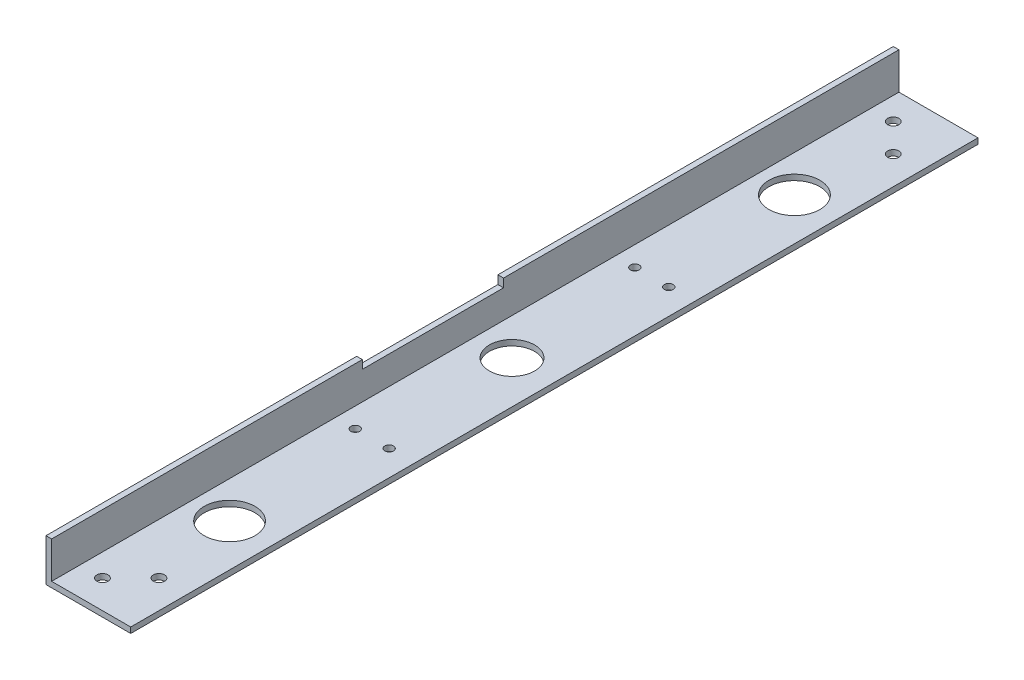
ISO-10303-21;
HEADER;
FILE_DESCRIPTION(('STEP AP214'),'2;1');
FILE_NAME('part.step','',(''),(''),'','','');
FILE_SCHEMA(('AUTOMOTIVE_DESIGN { 1 0 10303 214 1 1 1 1 }'));
ENDSEC;
DATA;
#1=APPLICATION_CONTEXT('core data for automotive mechanical design processes');
#2=APPLICATION_PROTOCOL_DEFINITION('international standard','automotive_design',2000,#1);
#3=PRODUCT_CONTEXT('',#1,'mechanical');
#4=PRODUCT('Part','Part','',(#3));
#5=PRODUCT_RELATED_PRODUCT_CATEGORY('part','',(#4));
#6=PRODUCT_DEFINITION_FORMATION('','',#4);
#7=PRODUCT_DEFINITION_CONTEXT('part definition',#1,'design');
#8=PRODUCT_DEFINITION('design','',#6,#7);
#9=PRODUCT_DEFINITION_SHAPE('','',#8);
#10=(LENGTH_UNIT() NAMED_UNIT(*) SI_UNIT(.MILLI.,.METRE.));
#11=(NAMED_UNIT(*) PLANE_ANGLE_UNIT() SI_UNIT($,.RADIAN.));
#12=(NAMED_UNIT(*) SI_UNIT($,.STERADIAN.) SOLID_ANGLE_UNIT());
#13=UNCERTAINTY_MEASURE_WITH_UNIT(LENGTH_MEASURE(1.E-05),#10,'distance_accuracy_value','');
#14=(GEOMETRIC_REPRESENTATION_CONTEXT(3) GLOBAL_UNCERTAINTY_ASSIGNED_CONTEXT((#13)) GLOBAL_UNIT_ASSIGNED_CONTEXT((#10,
#11,#12)) REPRESENTATION_CONTEXT('',''));
#15=CARTESIAN_POINT('',(0.,0.,0.));
#16=DIRECTION('',(0.,0.,1.));
#17=DIRECTION('',(1.,0.,0.));
#18=AXIS2_PLACEMENT_3D('',#15,#16,#17);
#19=CARTESIAN_POINT('',(-8.,15.,300.));
#20=DIRECTION('',(0.,-1.,0.));
#21=DIRECTION('',(1.,0.,0.));
#22=AXIS2_PLACEMENT_3D('',#19,#20,#21);
#23=PLANE('',#22);
#24=DIRECTION('',(0.,0.,-1.));
#25=VECTOR('',#24,1.);
#26=CARTESIAN_POINT('',(0.,15.,300.));
#27=LINE('',#26,#25);
#28=CARTESIAN_POINT('',(0.,15.,140.));
#29=VERTEX_POINT('',#28);
#30=CARTESIAN_POINT('',(0.,15.,0.));
#31=VERTEX_POINT('',#30);
#32=EDGE_CURVE('E125',#29,#31,#27,.T.);
#33=ORIENTED_EDGE('',*,*,#32,.F.);
#34=DIRECTION('',(1.,0.,0.));
#35=VECTOR('',#34,1.);
#36=CARTESIAN_POINT('',(-8.,15.,140.));
#37=LINE('',#36,#35);
#38=CARTESIAN_POINT('',(2.,15.,140.));
#39=VERTEX_POINT('',#38);
#40=EDGE_CURVE('E41',#29,#39,#37,.T.);
#41=ORIENTED_EDGE('',*,*,#40,.T.);
#42=DIRECTION('',(0.,0.,-1.));
#43=VECTOR('',#42,1.);
#44=CARTESIAN_POINT('',(2.,15.,300.));
#45=LINE('',#44,#43);
#46=CARTESIAN_POINT('',(2.,15.,0.));
#47=VERTEX_POINT('',#46);
#48=EDGE_CURVE('E57',#39,#47,#45,.T.);
#49=ORIENTED_EDGE('',*,*,#48,.T.);
#50=DIRECTION('',(-1.,0.,0.));
#51=VECTOR('',#50,1.);
#52=CARTESIAN_POINT('',(0.,15.,0.));
#53=LINE('',#52,#51);
#54=EDGE_CURVE('E208',#47,#31,#53,.T.);
#55=ORIENTED_EDGE('',*,*,#54,.T.);
#56=EDGE_LOOP('',(#33,#41,#49,#55));
#57=FACE_BOUND('',#56,.T.);
#58=ADVANCED_FACE('F32',(#57),#23,.F.);
#59=CARTESIAN_POINT('',(30.,0.,300.));
#60=DIRECTION('',(0.,1.,0.));
#61=DIRECTION('',(-1.,0.,0.));
#62=AXIS2_PLACEMENT_3D('',#59,#60,#61);
#63=PLANE('',#62);
#64=CARTESIAN_POINT('',(14.999999999986,0.,50.0000000000007));
#65=DIRECTION('',(0.,-1.,0.));
#66=DIRECTION('',(1.,0.,0.));
#67=AXIS2_PLACEMENT_3D('',#64,#65,#66);
#68=CIRCLE('',#67,9.);
#69=CARTESIAN_POINT('',(23.999999999986,0.,50.0000000000007));
#70=VERTEX_POINT('',#69);
#71=EDGE_CURVE('E237',#70,#70,#68,.T.);
#72=ORIENTED_EDGE('',*,*,#71,.F.);
#73=EDGE_LOOP('',(#72));
#74=FACE_BOUND('',#73,.T.);
#75=CARTESIAN_POINT('',(14.9999999999838,0.,249.999999999999));
#76=DIRECTION('',(0.,-1.,0.));
#77=DIRECTION('',(1.,0.,0.));
#78=AXIS2_PLACEMENT_3D('',#75,#76,#77);
#79=CIRCLE('',#78,9.00000000000001);
#80=CARTESIAN_POINT('',(23.9999999999838,0.,249.999999999999));
#81=VERTEX_POINT('',#80);
#82=EDGE_CURVE('E227',#81,#81,#79,.T.);
#83=ORIENTED_EDGE('',*,*,#82,.F.);
#84=EDGE_LOOP('',(#83));
#85=FACE_BOUND('',#84,.T.);
#86=CARTESIAN_POINT('',(8.99999999999958,0.,100.5));
#87=DIRECTION('',(0.,-1.,0.));
#88=DIRECTION('',(1.,0.,0.));
#89=AXIS2_PLACEMENT_3D('',#86,#87,#88);
#90=CIRCLE('',#89,1.5500000000026);
#91=CARTESIAN_POINT('',(10.5500000000022,0.,100.5));
#92=VERTEX_POINT('',#91);
#93=EDGE_CURVE('E224',#92,#92,#90,.T.);
#94=ORIENTED_EDGE('',*,*,#93,.F.);
#95=EDGE_LOOP('',(#94));
#96=FACE_BOUND('',#95,.T.);
#97=CARTESIAN_POINT('',(20.9999999999996,0.,100.5));
#98=DIRECTION('',(0.,-1.,0.));
#99=DIRECTION('',(1.,0.,0.));
#100=AXIS2_PLACEMENT_3D('',#97,#98,#99);
#101=CIRCLE('',#100,1.55000000000261);
#102=CARTESIAN_POINT('',(22.5500000000022,0.,100.5));
#103=VERTEX_POINT('',#102);
#104=EDGE_CURVE('E221',#103,#103,#101,.T.);
#105=ORIENTED_EDGE('',*,*,#104,.F.);
#106=EDGE_LOOP('',(#105));
#107=FACE_BOUND('',#106,.T.);
#108=CARTESIAN_POINT('',(8.99999999999964,0.,199.5));
#109=DIRECTION('',(0.,-1.,0.));
#110=DIRECTION('',(1.,0.,0.));
#111=AXIS2_PLACEMENT_3D('',#108,#109,#110);
#112=CIRCLE('',#111,1.54999999999999);
#113=CARTESIAN_POINT('',(10.5499999999996,0.,199.5));
#114=VERTEX_POINT('',#113);
#115=EDGE_CURVE('E217',#114,#114,#112,.T.);
#116=ORIENTED_EDGE('',*,*,#115,.F.);
#117=EDGE_LOOP('',(#116));
#118=FACE_BOUND('',#117,.T.);
#119=CARTESIAN_POINT('',(20.9999999999996,0.,199.5));
#120=DIRECTION('',(0.,-1.,0.));
#121=DIRECTION('',(1.,0.,0.));
#122=AXIS2_PLACEMENT_3D('',#119,#120,#121);
#123=CIRCLE('',#122,1.55000000000001);
#124=CARTESIAN_POINT('',(22.5499999999996,0.,199.5));
#125=VERTEX_POINT('',#124);
#126=EDGE_CURVE('E213',#125,#125,#123,.T.);
#127=ORIENTED_EDGE('',*,*,#126,.F.);
#128=EDGE_LOOP('',(#127));
#129=FACE_BOUND('',#128,.T.);
#130=CARTESIAN_POINT('',(20.,0.,280.));
#131=DIRECTION('',(0.,1.,0.));
#132=DIRECTION('',(-1.,0.,0.));
#133=AXIS2_PLACEMENT_3D('',#130,#131,#132);
#134=CIRCLE('',#133,1.9776934087646);
#135=CARTESIAN_POINT('',(18.0223065912354,0.,280.));
#136=VERTEX_POINT('',#135);
#137=EDGE_CURVE('E148',#136,#136,#134,.T.);
#138=ORIENTED_EDGE('',*,*,#137,.T.);
#139=EDGE_LOOP('',(#138));
#140=FACE_BOUND('',#139,.T.);
#141=CARTESIAN_POINT('',(10.,0.,290.));
#142=DIRECTION('',(0.,1.,0.));
#143=DIRECTION('',(-1.,0.,0.));
#144=AXIS2_PLACEMENT_3D('',#141,#142,#143);
#145=CIRCLE('',#144,1.97769340876459);
#146=CARTESIAN_POINT('',(8.02230659123541,0.,290.));
#147=VERTEX_POINT('',#146);
#148=EDGE_CURVE('E154',#147,#147,#145,.T.);
#149=ORIENTED_EDGE('',*,*,#148,.T.);
#150=EDGE_LOOP('',(#149));
#151=FACE_BOUND('',#150,.T.);
#152=CARTESIAN_POINT('',(20.,0.,20.));
#153=DIRECTION('',(0.,1.,0.));
#154=DIRECTION('',(-1.,0.,0.));
#155=AXIS2_PLACEMENT_3D('',#152,#153,#154);
#156=CIRCLE('',#155,1.9776934087646);
#157=CARTESIAN_POINT('',(18.0223065912354,0.,20.));
#158=VERTEX_POINT('',#157);
#159=EDGE_CURVE('E160',#158,#158,#156,.T.);
#160=ORIENTED_EDGE('',*,*,#159,.T.);
#161=EDGE_LOOP('',(#160));
#162=FACE_BOUND('',#161,.T.);
#163=CARTESIAN_POINT('',(9.99999999999991,0.,10.));
#164=DIRECTION('',(0.,1.,0.));
#165=DIRECTION('',(-1.,0.,0.));
#166=AXIS2_PLACEMENT_3D('',#163,#164,#165);
#167=CIRCLE('',#166,1.9776934087646);
#168=CARTESIAN_POINT('',(8.02230659123532,0.,10.));
#169=VERTEX_POINT('',#168);
#170=EDGE_CURVE('E166',#169,#169,#167,.T.);
#171=ORIENTED_EDGE('',*,*,#170,.T.);
#172=EDGE_LOOP('',(#171));
#173=FACE_BOUND('',#172,.T.);
#174=CARTESIAN_POINT('',(15.,0.,150.));
#175=DIRECTION('',(0.,1.,0.));
#176=DIRECTION('',(-1.,0.,0.));
#177=AXIS2_PLACEMENT_3D('',#174,#175,#176);
#178=CIRCLE('',#177,8.);
#179=CARTESIAN_POINT('',(6.99999999999999,0.,150.));
#180=VERTEX_POINT('',#179);
#181=EDGE_CURVE('E172',#180,#180,#178,.T.);
#182=ORIENTED_EDGE('',*,*,#181,.T.);
#183=EDGE_LOOP('',(#182));
#184=FACE_BOUND('',#183,.T.);
#185=DIRECTION('',(1.,0.,0.));
#186=VECTOR('',#185,1.);
#187=CARTESIAN_POINT('',(30.,0.,0.));
#188=LINE('',#187,#186);
#189=CARTESIAN_POINT('',(0.,0.,0.));
#190=VERTEX_POINT('',#189);
#191=CARTESIAN_POINT('',(30.,0.,0.));
#192=VERTEX_POINT('',#191);
#193=EDGE_CURVE('E175',#190,#192,#188,.T.);
#194=ORIENTED_EDGE('',*,*,#193,.T.);
#195=DIRECTION('',(0.,0.,-1.));
#196=VECTOR('',#195,1.);
#197=CARTESIAN_POINT('',(30.,0.,300.));
#198=LINE('',#197,#196);
#199=CARTESIAN_POINT('',(30.,0.,300.));
#200=VERTEX_POINT('',#199);
#201=EDGE_CURVE('E205',#200,#192,#198,.T.);
#202=ORIENTED_EDGE('',*,*,#201,.F.);
#203=DIRECTION('',(1.,0.,0.));
#204=VECTOR('',#203,1.);
#205=CARTESIAN_POINT('',(30.,0.,300.));
#206=LINE('',#205,#204);
#207=CARTESIAN_POINT('',(0.,0.,300.));
#208=VERTEX_POINT('',#207);
#209=EDGE_CURVE('E176',#208,#200,#206,.T.);
#210=ORIENTED_EDGE('',*,*,#209,.F.);
#211=DIRECTION('',(0.,0.,-1.));
#212=VECTOR('',#211,1.);
#213=CARTESIAN_POINT('',(0.,0.,300.));
#214=LINE('',#213,#212);
#215=EDGE_CURVE('E189',#208,#190,#214,.T.);
#216=ORIENTED_EDGE('',*,*,#215,.T.);
#217=EDGE_LOOP('',(#194,#202,#210,#216));
#218=FACE_BOUND('',#217,.T.);
#219=ADVANCED_FACE('F34',(#74,#85,#96,#107,#118,#129,#140,#151,#162,#173,#184,#218),#63,.F.);
#220=CARTESIAN_POINT('',(30.,2.,300.));
#221=DIRECTION('',(-1.,0.,0.));
#222=DIRECTION('',(0.,0.,1.));
#223=AXIS2_PLACEMENT_3D('',#220,#221,#222);
#224=PLANE('',#223);
#225=DIRECTION('',(0.,1.,0.));
#226=VECTOR('',#225,1.);
#227=CARTESIAN_POINT('',(30.,2.,0.));
#228=LINE('',#227,#226);
#229=CARTESIAN_POINT('',(30.,2.,0.));
#230=VERTEX_POINT('',#229);
#231=EDGE_CURVE('E192',#192,#230,#228,.T.);
#232=ORIENTED_EDGE('',*,*,#231,.T.);
#233=DIRECTION('',(0.,0.,-1.));
#234=VECTOR('',#233,1.);
#235=CARTESIAN_POINT('',(30.,2.,300.));
#236=LINE('',#235,#234);
#237=CARTESIAN_POINT('',(30.,2.,300.));
#238=VERTEX_POINT('',#237);
#239=EDGE_CURVE('E202',#238,#230,#236,.T.);
#240=ORIENTED_EDGE('',*,*,#239,.F.);
#241=DIRECTION('',(0.,1.,0.));
#242=VECTOR('',#241,1.);
#243=CARTESIAN_POINT('',(30.,2.,300.));
#244=LINE('',#243,#242);
#245=EDGE_CURVE('E179',#200,#238,#244,.T.);
#246=ORIENTED_EDGE('',*,*,#245,.F.);
#247=ORIENTED_EDGE('',*,*,#201,.T.);
#248=EDGE_LOOP('',(#232,#240,#246,#247));
#249=FACE_BOUND('',#248,.T.);
#250=ADVANCED_FACE('F284',(#249),#224,.F.);
#251=CARTESIAN_POINT('',(2.,2.,300.));
#252=DIRECTION('',(0.,-1.,0.));
#253=DIRECTION('',(0.,0.,-1.));
#254=AXIS2_PLACEMENT_3D('',#251,#252,#253);
#255=PLANE('',#254);
#256=CARTESIAN_POINT('',(14.999999999986,2.,50.0000000000007));
#257=DIRECTION('',(0.,-1.,0.));
#258=DIRECTION('',(0.,0.,-1.));
#259=AXIS2_PLACEMENT_3D('',#256,#257,#258);
#260=CIRCLE('',#259,9.);
#261=CARTESIAN_POINT('',(14.999999999986,2.,41.0000000000007));
#262=VERTEX_POINT('',#261);
#263=EDGE_CURVE('E36',#262,#262,#260,.T.);
#264=ORIENTED_EDGE('',*,*,#263,.T.);
#265=EDGE_LOOP('',(#264));
#266=FACE_BOUND('',#265,.T.);
#267=CARTESIAN_POINT('',(14.9999999999838,2.,249.999999999999));
#268=DIRECTION('',(0.,-1.,0.));
#269=DIRECTION('',(0.,0.,-1.));
#270=AXIS2_PLACEMENT_3D('',#267,#268,#269);
#271=CIRCLE('',#270,9.00000000000001);
#272=CARTESIAN_POINT('',(14.9999999999838,2.,240.999999999999));
#273=VERTEX_POINT('',#272);
#274=EDGE_CURVE('E225',#273,#273,#271,.T.);
#275=ORIENTED_EDGE('',*,*,#274,.T.);
#276=EDGE_LOOP('',(#275));
#277=FACE_BOUND('',#276,.T.);
#278=CARTESIAN_POINT('',(8.99999999999958,2.,100.5));
#279=DIRECTION('',(0.,-1.,0.));
#280=DIRECTION('',(0.,0.,-1.));
#281=AXIS2_PLACEMENT_3D('',#278,#279,#280);
#282=CIRCLE('',#281,1.5500000000026);
#283=CARTESIAN_POINT('',(8.99999999999958,2.,98.9499999999969));
#284=VERTEX_POINT('',#283);
#285=EDGE_CURVE('E222',#284,#284,#282,.T.);
#286=ORIENTED_EDGE('',*,*,#285,.T.);
#287=EDGE_LOOP('',(#286));
#288=FACE_BOUND('',#287,.T.);
#289=CARTESIAN_POINT('',(20.9999999999996,2.,100.5));
#290=DIRECTION('',(0.,-1.,0.));
#291=DIRECTION('',(0.,0.,-1.));
#292=AXIS2_PLACEMENT_3D('',#289,#290,#291);
#293=CIRCLE('',#292,1.55000000000261);
#294=CARTESIAN_POINT('',(20.9999999999996,2.,98.9499999999969));
#295=VERTEX_POINT('',#294);
#296=EDGE_CURVE('E218',#295,#295,#293,.T.);
#297=ORIENTED_EDGE('',*,*,#296,.T.);
#298=EDGE_LOOP('',(#297));
#299=FACE_BOUND('',#298,.T.);
#300=CARTESIAN_POINT('',(8.99999999999964,2.,199.5));
#301=DIRECTION('',(0.,-1.,0.));
#302=DIRECTION('',(0.,0.,-1.));
#303=AXIS2_PLACEMENT_3D('',#300,#301,#302);
#304=CIRCLE('',#303,1.54999999999999);
#305=CARTESIAN_POINT('',(8.99999999999964,2.,197.95));
#306=VERTEX_POINT('',#305);
#307=EDGE_CURVE('E214',#306,#306,#304,.T.);
#308=ORIENTED_EDGE('',*,*,#307,.T.);
#309=EDGE_LOOP('',(#308));
#310=FACE_BOUND('',#309,.T.);
#311=CARTESIAN_POINT('',(20.9999999999996,2.,199.5));
#312=DIRECTION('',(0.,-1.,0.));
#313=DIRECTION('',(0.,0.,-1.));
#314=AXIS2_PLACEMENT_3D('',#311,#312,#313);
#315=CIRCLE('',#314,1.55000000000001);
#316=CARTESIAN_POINT('',(20.9999999999996,2.,197.95));
#317=VERTEX_POINT('',#316);
#318=EDGE_CURVE('E122',#317,#317,#315,.T.);
#319=ORIENTED_EDGE('',*,*,#318,.T.);
#320=EDGE_LOOP('',(#319));
#321=FACE_BOUND('',#320,.T.);
#322=CARTESIAN_POINT('',(20.,2.,280.));
#323=DIRECTION('',(0.,1.,0.));
#324=DIRECTION('',(-1.,0.,0.));
#325=AXIS2_PLACEMENT_3D('',#322,#323,#324);
#326=CIRCLE('',#325,1.9776934087646);
#327=CARTESIAN_POINT('',(18.0223065912354,2.,280.));
#328=VERTEX_POINT('',#327);
#329=EDGE_CURVE('E145',#328,#328,#326,.T.);
#330=ORIENTED_EDGE('',*,*,#329,.F.);
#331=EDGE_LOOP('',(#330));
#332=FACE_BOUND('',#331,.T.);
#333=CARTESIAN_POINT('',(10.,2.,290.));
#334=DIRECTION('',(0.,1.,0.));
#335=DIRECTION('',(-1.,0.,0.));
#336=AXIS2_PLACEMENT_3D('',#333,#334,#335);
#337=CIRCLE('',#336,1.97769340876459);
#338=CARTESIAN_POINT('',(8.02230659123541,2.,290.));
#339=VERTEX_POINT('',#338);
#340=EDGE_CURVE('E151',#339,#339,#337,.T.);
#341=ORIENTED_EDGE('',*,*,#340,.F.);
#342=EDGE_LOOP('',(#341));
#343=FACE_BOUND('',#342,.T.);
#344=CARTESIAN_POINT('',(20.,2.,20.));
#345=DIRECTION('',(0.,1.,0.));
#346=DIRECTION('',(-1.,0.,0.));
#347=AXIS2_PLACEMENT_3D('',#344,#345,#346);
#348=CIRCLE('',#347,1.9776934087646);
#349=CARTESIAN_POINT('',(18.0223065912354,2.,20.));
#350=VERTEX_POINT('',#349);
#351=EDGE_CURVE('E157',#350,#350,#348,.T.);
#352=ORIENTED_EDGE('',*,*,#351,.F.);
#353=EDGE_LOOP('',(#352));
#354=FACE_BOUND('',#353,.T.);
#355=CARTESIAN_POINT('',(9.99999999999991,2.,10.));
#356=DIRECTION('',(0.,1.,0.));
#357=DIRECTION('',(-1.,0.,0.));
#358=AXIS2_PLACEMENT_3D('',#355,#356,#357);
#359=CIRCLE('',#358,1.9776934087646);
#360=CARTESIAN_POINT('',(8.02230659123532,2.,10.));
#361=VERTEX_POINT('',#360);
#362=EDGE_CURVE('E163',#361,#361,#359,.T.);
#363=ORIENTED_EDGE('',*,*,#362,.F.);
#364=EDGE_LOOP('',(#363));
#365=FACE_BOUND('',#364,.T.);
#366=CARTESIAN_POINT('',(15.,2.,150.));
#367=DIRECTION('',(0.,1.,0.));
#368=DIRECTION('',(-1.,0.,0.));
#369=AXIS2_PLACEMENT_3D('',#366,#367,#368);
#370=CIRCLE('',#369,8.);
#371=CARTESIAN_POINT('',(6.99999999999999,2.,150.));
#372=VERTEX_POINT('',#371);
#373=EDGE_CURVE('E169',#372,#372,#370,.T.);
#374=ORIENTED_EDGE('',*,*,#373,.F.);
#375=EDGE_LOOP('',(#374));
#376=FACE_BOUND('',#375,.T.);
#377=DIRECTION('',(-1.,0.,0.));
#378=VECTOR('',#377,1.);
#379=CARTESIAN_POINT('',(2.,2.,0.));
#380=LINE('',#379,#378);
#381=CARTESIAN_POINT('',(2.,2.,0.));
#382=VERTEX_POINT('',#381);
#383=EDGE_CURVE('E194',#230,#382,#380,.T.);
#384=ORIENTED_EDGE('',*,*,#383,.T.);
#385=DIRECTION('',(0.,0.,-1.));
#386=VECTOR('',#385,1.);
#387=CARTESIAN_POINT('',(2.,2.,300.));
#388=LINE('',#387,#386);
#389=CARTESIAN_POINT('',(2.,2.,300.));
#390=VERTEX_POINT('',#389);
#391=EDGE_CURVE('E200',#390,#382,#388,.T.);
#392=ORIENTED_EDGE('',*,*,#391,.F.);
#393=DIRECTION('',(-1.,0.,0.));
#394=VECTOR('',#393,1.);
#395=CARTESIAN_POINT('',(2.,2.,300.));
#396=LINE('',#395,#394);
#397=EDGE_CURVE('E182',#238,#390,#396,.T.);
#398=ORIENTED_EDGE('',*,*,#397,.F.);
#399=ORIENTED_EDGE('',*,*,#239,.T.);
#400=EDGE_LOOP('',(#384,#392,#398,#399));
#401=FACE_BOUND('',#400,.T.);
#402=ADVANCED_FACE('F316',(#266,#277,#288,#299,#310,#321,#332,#343,#354,#365,#376,#401),#255,.F.);
#403=CARTESIAN_POINT('',(2.,25.,300.));
#404=DIRECTION('',(-1.,0.,0.));
#405=DIRECTION('',(0.,-1.,0.));
#406=AXIS2_PLACEMENT_3D('',#403,#404,#405);
#407=PLANE('',#406);
#408=ORIENTED_EDGE('',*,*,#48,.F.);
#409=DIRECTION('',(0.,1.,0.));
#410=VECTOR('',#409,1.);
#411=CARTESIAN_POINT('',(2.,15.,140.));
#412=LINE('',#411,#410);
#413=CARTESIAN_POINT('',(2.,12.,140.));
#414=VERTEX_POINT('',#413);
#415=EDGE_CURVE('E113',#414,#39,#412,.T.);
#416=ORIENTED_EDGE('',*,*,#415,.F.);
#417=DIRECTION('',(0.,0.,-1.));
#418=VECTOR('',#417,1.);
#419=CARTESIAN_POINT('',(2.,12.,140.));
#420=LINE('',#419,#418);
#421=CARTESIAN_POINT('',(2.,12.,190.));
#422=VERTEX_POINT('',#421);
#423=EDGE_CURVE('E248',#422,#414,#420,.T.);
#424=ORIENTED_EDGE('',*,*,#423,.F.);
#425=DIRECTION('',(0.,-1.,0.));
#426=VECTOR('',#425,1.);
#427=CARTESIAN_POINT('',(2.,15.,190.));
#428=LINE('',#427,#426);
#429=CARTESIAN_POINT('',(2.,15.,190.));
#430=VERTEX_POINT('',#429);
#431=EDGE_CURVE('E121',#430,#422,#428,.T.);
#432=ORIENTED_EDGE('',*,*,#431,.F.);
#433=CARTESIAN_POINT('',(2.,15.,300.));
#434=VERTEX_POINT('',#433);
#435=EDGE_CURVE('E133',#434,#430,#45,.T.);
#436=ORIENTED_EDGE('',*,*,#435,.F.);
#437=DIRECTION('',(0.,1.,0.));
#438=VECTOR('',#437,1.);
#439=CARTESIAN_POINT('',(2.,25.,300.));
#440=LINE('',#439,#438);
#441=EDGE_CURVE('E184',#390,#434,#440,.T.);
#442=ORIENTED_EDGE('',*,*,#441,.F.);
#443=ORIENTED_EDGE('',*,*,#391,.T.);
#444=DIRECTION('',(0.,1.,0.));
#445=VECTOR('',#444,1.);
#446=CARTESIAN_POINT('',(2.,25.,0.));
#447=LINE('',#446,#445);
#448=EDGE_CURVE('E132',#382,#47,#447,.T.);
#449=ORIENTED_EDGE('',*,*,#448,.T.);
#450=EDGE_LOOP('',(#408,#416,#424,#432,#436,#442,#443,#449));
#451=FACE_BOUND('',#450,.T.);
#452=ADVANCED_FACE('F129',(#451),#407,.F.);
#453=CARTESIAN_POINT('',(0.,0.,300.));
#454=DIRECTION('',(1.,0.,0.));
#455=DIRECTION('',(0.,0.,-1.));
#456=AXIS2_PLACEMENT_3D('',#453,#454,#455);
#457=PLANE('',#456);
#458=DIRECTION('',(0.,0.,-1.));
#459=VECTOR('',#458,1.);
#460=CARTESIAN_POINT('',(0.,11.9999999999999,300.));
#461=LINE('',#460,#459);
#462=CARTESIAN_POINT('',(0.,12.,190.));
#463=VERTEX_POINT('',#462);
#464=CARTESIAN_POINT('',(0.,12.,140.));
#465=VERTEX_POINT('',#464);
#466=EDGE_CURVE('E11',#463,#465,#461,.T.);
#467=ORIENTED_EDGE('',*,*,#466,.T.);
#468=DIRECTION('',(0.,1.,0.));
#469=VECTOR('',#468,1.);
#470=CARTESIAN_POINT('',(0.,0.,140.));
#471=LINE('',#470,#469);
#472=EDGE_CURVE('E134',#465,#29,#471,.T.);
#473=ORIENTED_EDGE('',*,*,#472,.T.);
#474=ORIENTED_EDGE('',*,*,#32,.T.);
#475=DIRECTION('',(0.,-1.,0.));
#476=VECTOR('',#475,1.);
#477=CARTESIAN_POINT('',(0.,0.,0.));
#478=LINE('',#477,#476);
#479=EDGE_CURVE('E180',#31,#190,#478,.T.);
#480=ORIENTED_EDGE('',*,*,#479,.T.);
#481=ORIENTED_EDGE('',*,*,#215,.F.);
#482=DIRECTION('',(0.,-1.,0.));
#483=VECTOR('',#482,1.);
#484=CARTESIAN_POINT('',(0.,0.,300.));
#485=LINE('',#484,#483);
#486=CARTESIAN_POINT('',(0.,15.,300.));
#487=VERTEX_POINT('',#486);
#488=EDGE_CURVE('E187',#487,#208,#485,.T.);
#489=ORIENTED_EDGE('',*,*,#488,.F.);
#490=CARTESIAN_POINT('',(0.,15.,190.));
#491=VERTEX_POINT('',#490);
#492=EDGE_CURVE('E142',#487,#491,#27,.T.);
#493=ORIENTED_EDGE('',*,*,#492,.T.);
#494=DIRECTION('',(0.,-1.,0.));
#495=VECTOR('',#494,1.);
#496=CARTESIAN_POINT('',(0.,0.,190.));
#497=LINE('',#496,#495);
#498=EDGE_CURVE('E49',#491,#463,#497,.T.);
#499=ORIENTED_EDGE('',*,*,#498,.T.);
#500=EDGE_LOOP('',(#467,#473,#474,#480,#481,#489,#493,#499));
#501=FACE_BOUND('',#500,.T.);
#502=ADVANCED_FACE('F253',(#501),#457,.F.);
#503=CARTESIAN_POINT('',(0.,0.,300.));
#504=DIRECTION('',(0.,0.,-1.));
#505=DIRECTION('',(-1.,0.,0.));
#506=AXIS2_PLACEMENT_3D('',#503,#504,#505);
#507=PLANE('',#506);
#508=ORIENTED_EDGE('',*,*,#441,.T.);
#509=DIRECTION('',(1.,0.,0.));
#510=VECTOR('',#509,1.);
#511=CARTESIAN_POINT('',(-8.,15.,300.));
#512=LINE('',#511,#510);
#513=EDGE_CURVE('E137',#487,#434,#512,.T.);
#514=ORIENTED_EDGE('',*,*,#513,.F.);
#515=ORIENTED_EDGE('',*,*,#488,.T.);
#516=ORIENTED_EDGE('',*,*,#209,.T.);
#517=ORIENTED_EDGE('',*,*,#245,.T.);
#518=ORIENTED_EDGE('',*,*,#397,.T.);
#519=EDGE_LOOP('',(#508,#514,#515,#516,#517,#518));
#520=FACE_BOUND('',#519,.T.);
#521=ADVANCED_FACE('F261',(#520),#507,.F.);
#522=CARTESIAN_POINT('',(0.,0.,0.));
#523=DIRECTION('',(0.,0.,-1.));
#524=DIRECTION('',(-1.,0.,0.));
#525=AXIS2_PLACEMENT_3D('',#522,#523,#524);
#526=PLANE('',#525);
#527=ORIENTED_EDGE('',*,*,#54,.F.);
#528=ORIENTED_EDGE('',*,*,#448,.F.);
#529=ORIENTED_EDGE('',*,*,#383,.F.);
#530=ORIENTED_EDGE('',*,*,#231,.F.);
#531=ORIENTED_EDGE('',*,*,#193,.F.);
#532=ORIENTED_EDGE('',*,*,#479,.F.);
#533=EDGE_LOOP('',(#527,#528,#529,#530,#531,#532));
#534=FACE_BOUND('',#533,.T.);
#535=ADVANCED_FACE('F305',(#534),#526,.T.);
#536=CARTESIAN_POINT('',(15.,-8.,150.));
#537=DIRECTION('',(0.,1.,0.));
#538=DIRECTION('',(-1.,0.,0.));
#539=AXIS2_PLACEMENT_3D('',#536,#537,#538);
#540=CYLINDRICAL_SURFACE('',#539,8.);
#541=ORIENTED_EDGE('',*,*,#373,.T.);
#542=EDGE_LOOP('',(#541));
#543=FACE_BOUND('',#542,.T.);
#544=ORIENTED_EDGE('',*,*,#181,.F.);
#545=EDGE_LOOP('',(#544));
#546=FACE_BOUND('',#545,.T.);
#547=ADVANCED_FACE('F301',(#543,#546),#540,.F.);
#548=CARTESIAN_POINT('',(9.99999999999991,-8.,10.));
#549=DIRECTION('',(0.,1.,0.));
#550=DIRECTION('',(-1.,0.,0.));
#551=AXIS2_PLACEMENT_3D('',#548,#549,#550);
#552=CYLINDRICAL_SURFACE('',#551,1.9776934087646);
#553=ORIENTED_EDGE('',*,*,#362,.T.);
#554=EDGE_LOOP('',(#553));
#555=FACE_BOUND('',#554,.T.);
#556=ORIENTED_EDGE('',*,*,#170,.F.);
#557=EDGE_LOOP('',(#556));
#558=FACE_BOUND('',#557,.T.);
#559=ADVANCED_FACE('F297',(#555,#558),#552,.F.);
#560=CARTESIAN_POINT('',(20.,-8.,20.));
#561=DIRECTION('',(0.,1.,0.));
#562=DIRECTION('',(-1.,0.,0.));
#563=AXIS2_PLACEMENT_3D('',#560,#561,#562);
#564=CYLINDRICAL_SURFACE('',#563,1.9776934087646);
#565=ORIENTED_EDGE('',*,*,#351,.T.);
#566=EDGE_LOOP('',(#565));
#567=FACE_BOUND('',#566,.T.);
#568=ORIENTED_EDGE('',*,*,#159,.F.);
#569=EDGE_LOOP('',(#568));
#570=FACE_BOUND('',#569,.T.);
#571=ADVANCED_FACE('F293',(#567,#570),#564,.F.);
#572=CARTESIAN_POINT('',(10.,-8.,290.));
#573=DIRECTION('',(0.,1.,0.));
#574=DIRECTION('',(-1.,0.,0.));
#575=AXIS2_PLACEMENT_3D('',#572,#573,#574);
#576=CYLINDRICAL_SURFACE('',#575,1.97769340876459);
#577=ORIENTED_EDGE('',*,*,#340,.T.);
#578=EDGE_LOOP('',(#577));
#579=FACE_BOUND('',#578,.T.);
#580=ORIENTED_EDGE('',*,*,#148,.F.);
#581=EDGE_LOOP('',(#580));
#582=FACE_BOUND('',#581,.T.);
#583=ADVANCED_FACE('F289',(#579,#582),#576,.F.);
#584=CARTESIAN_POINT('',(20.,-8.,280.));
#585=DIRECTION('',(0.,1.,0.));
#586=DIRECTION('',(-1.,0.,0.));
#587=AXIS2_PLACEMENT_3D('',#584,#585,#586);
#588=CYLINDRICAL_SURFACE('',#587,1.9776934087646);
#589=ORIENTED_EDGE('',*,*,#329,.T.);
#590=EDGE_LOOP('',(#589));
#591=FACE_BOUND('',#590,.T.);
#592=ORIENTED_EDGE('',*,*,#137,.F.);
#593=EDGE_LOOP('',(#592));
#594=FACE_BOUND('',#593,.T.);
#595=ADVANCED_FACE('F276',(#591,#594),#588,.F.);
#596=ORIENTED_EDGE('',*,*,#435,.T.);
#597=DIRECTION('',(-1.,0.,0.));
#598=VECTOR('',#597,1.);
#599=CARTESIAN_POINT('',(-8.,15.,190.));
#600=LINE('',#599,#598);
#601=EDGE_CURVE('E126',#430,#491,#600,.T.);
#602=ORIENTED_EDGE('',*,*,#601,.T.);
#603=ORIENTED_EDGE('',*,*,#492,.F.);
#604=ORIENTED_EDGE('',*,*,#513,.T.);
#605=EDGE_LOOP('',(#596,#602,#603,#604));
#606=FACE_BOUND('',#605,.T.);
#607=ADVANCED_FACE('F258',(#606),#23,.F.);
#608=CARTESIAN_POINT('',(-8.,12.,140.));
#609=DIRECTION('',(0.,-1.,0.));
#610=DIRECTION('',(0.,0.,-1.));
#611=AXIS2_PLACEMENT_3D('',#608,#609,#610);
#612=PLANE('',#611);
#613=DIRECTION('',(1.,0.,0.));
#614=VECTOR('',#613,1.);
#615=CARTESIAN_POINT('',(-8.,12.,190.));
#616=LINE('',#615,#614);
#617=EDGE_CURVE('E250',#463,#422,#616,.T.);
#618=ORIENTED_EDGE('',*,*,#617,.T.);
#619=ORIENTED_EDGE('',*,*,#423,.T.);
#620=DIRECTION('',(1.,0.,0.));
#621=VECTOR('',#620,1.);
#622=CARTESIAN_POINT('',(-8.,12.,140.));
#623=LINE('',#622,#621);
#624=EDGE_CURVE('E117',#465,#414,#623,.T.);
#625=ORIENTED_EDGE('',*,*,#624,.F.);
#626=ORIENTED_EDGE('',*,*,#466,.F.);
#627=EDGE_LOOP('',(#618,#619,#625,#626));
#628=FACE_BOUND('',#627,.T.);
#629=ADVANCED_FACE('F268',(#628),#612,.F.);
#630=CARTESIAN_POINT('',(-8.,15.,140.));
#631=DIRECTION('',(0.,0.,-1.));
#632=DIRECTION('',(-1.,0.,0.));
#633=AXIS2_PLACEMENT_3D('',#630,#631,#632);
#634=PLANE('',#633);
#635=ORIENTED_EDGE('',*,*,#624,.T.);
#636=ORIENTED_EDGE('',*,*,#415,.T.);
#637=ORIENTED_EDGE('',*,*,#40,.F.);
#638=ORIENTED_EDGE('',*,*,#472,.F.);
#639=EDGE_LOOP('',(#635,#636,#637,#638));
#640=FACE_BOUND('',#639,.T.);
#641=ADVANCED_FACE('F114',(#640),#634,.F.);
#642=CARTESIAN_POINT('',(-8.,15.,190.));
#643=DIRECTION('',(0.,0.,1.));
#644=DIRECTION('',(1.,0.,0.));
#645=AXIS2_PLACEMENT_3D('',#642,#643,#644);
#646=PLANE('',#645);
#647=ORIENTED_EDGE('',*,*,#601,.F.);
#648=ORIENTED_EDGE('',*,*,#431,.T.);
#649=ORIENTED_EDGE('',*,*,#617,.F.);
#650=ORIENTED_EDGE('',*,*,#498,.F.);
#651=EDGE_LOOP('',(#647,#648,#649,#650));
#652=FACE_BOUND('',#651,.T.);
#653=ADVANCED_FACE('F266',(#652),#646,.F.);
#654=CARTESIAN_POINT('',(20.9999999999996,273.,199.5));
#655=DIRECTION('',(0.,-1.,0.));
#656=DIRECTION('',(1.,0.,0.));
#657=AXIS2_PLACEMENT_3D('',#654,#655,#656);
#658=CYLINDRICAL_SURFACE('',#657,1.55000000000001);
#659=ORIENTED_EDGE('',*,*,#126,.T.);
#660=EDGE_LOOP('',(#659));
#661=FACE_BOUND('',#660,.T.);
#662=ORIENTED_EDGE('',*,*,#318,.F.);
#663=EDGE_LOOP('',(#662));
#664=FACE_BOUND('',#663,.T.);
#665=ADVANCED_FACE('F398',(#661,#664),#658,.F.);
#666=CARTESIAN_POINT('',(8.99999999999963,273.,199.5));
#667=DIRECTION('',(0.,-1.,0.));
#668=DIRECTION('',(1.,0.,0.));
#669=AXIS2_PLACEMENT_3D('',#666,#667,#668);
#670=CYLINDRICAL_SURFACE('',#669,1.54999999999999);
#671=ORIENTED_EDGE('',*,*,#115,.T.);
#672=EDGE_LOOP('',(#671));
#673=FACE_BOUND('',#672,.T.);
#674=ORIENTED_EDGE('',*,*,#307,.F.);
#675=EDGE_LOOP('',(#674));
#676=FACE_BOUND('',#675,.T.);
#677=ADVANCED_FACE('F406',(#673,#676),#670,.F.);
#678=CARTESIAN_POINT('',(20.9999999999996,273.,100.5));
#679=DIRECTION('',(0.,-1.,0.));
#680=DIRECTION('',(1.,0.,0.));
#681=AXIS2_PLACEMENT_3D('',#678,#679,#680);
#682=CYLINDRICAL_SURFACE('',#681,1.55000000000261);
#683=ORIENTED_EDGE('',*,*,#104,.T.);
#684=EDGE_LOOP('',(#683));
#685=FACE_BOUND('',#684,.T.);
#686=ORIENTED_EDGE('',*,*,#296,.F.);
#687=EDGE_LOOP('',(#686));
#688=FACE_BOUND('',#687,.T.);
#689=ADVANCED_FACE('F415',(#685,#688),#682,.F.);
#690=CARTESIAN_POINT('',(8.99999999999958,273.,100.5));
#691=DIRECTION('',(0.,-1.,0.));
#692=DIRECTION('',(1.,0.,0.));
#693=AXIS2_PLACEMENT_3D('',#690,#691,#692);
#694=CYLINDRICAL_SURFACE('',#693,1.5500000000026);
#695=ORIENTED_EDGE('',*,*,#93,.T.);
#696=EDGE_LOOP('',(#695));
#697=FACE_BOUND('',#696,.T.);
#698=ORIENTED_EDGE('',*,*,#285,.F.);
#699=EDGE_LOOP('',(#698));
#700=FACE_BOUND('',#699,.T.);
#701=ADVANCED_FACE('F425',(#697,#700),#694,.F.);
#702=CARTESIAN_POINT('',(14.9999999999838,5.,249.999999999999));
#703=DIRECTION('',(0.,-1.,0.));
#704=DIRECTION('',(1.,0.,0.));
#705=AXIS2_PLACEMENT_3D('',#702,#703,#704);
#706=CYLINDRICAL_SURFACE('',#705,9.00000000000001);
#707=ORIENTED_EDGE('',*,*,#82,.T.);
#708=EDGE_LOOP('',(#707));
#709=FACE_BOUND('',#708,.T.);
#710=ORIENTED_EDGE('',*,*,#274,.F.);
#711=EDGE_LOOP('',(#710));
#712=FACE_BOUND('',#711,.T.);
#713=ADVANCED_FACE('F434',(#709,#712),#706,.F.);
#714=CARTESIAN_POINT('',(14.999999999986,5.,50.0000000000007));
#715=DIRECTION('',(0.,-1.,0.));
#716=DIRECTION('',(1.,0.,0.));
#717=AXIS2_PLACEMENT_3D('',#714,#715,#716);
#718=CYLINDRICAL_SURFACE('',#717,9.);
#719=ORIENTED_EDGE('',*,*,#71,.T.);
#720=EDGE_LOOP('',(#719));
#721=FACE_BOUND('',#720,.T.);
#722=ORIENTED_EDGE('',*,*,#263,.F.);
#723=EDGE_LOOP('',(#722));
#724=FACE_BOUND('',#723,.T.);
#725=ADVANCED_FACE('F470',(#721,#724),#718,.F.);
#726=CLOSED_SHELL('',(#58,#219,#250,#402,#452,#502,#521,#535,#547,#559,#571,#583,#595,#607,#629,
#641,#653,#665,#677,#689,#701,#713,#725));
#727=MANIFOLD_SOLID_BREP('B2',#726);
#728=ADVANCED_BREP_SHAPE_REPRESENTATION('',(#18,#727),#14);
#729=SHAPE_DEFINITION_REPRESENTATION(#9,#728);
ENDSEC;
END-ISO-10303-21;
